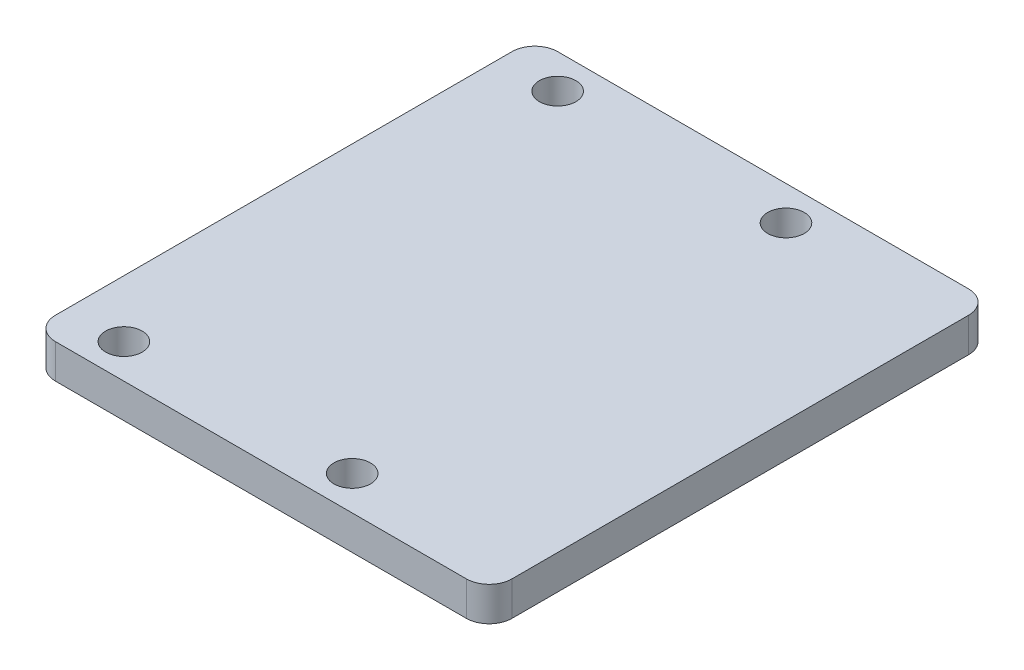
ISO-10303-21;
HEADER;
FILE_DESCRIPTION(('STEP AP214'),'2;1');
FILE_NAME('part.step','',(''),(''),'','','');
FILE_SCHEMA(('AUTOMOTIVE_DESIGN { 1 0 10303 214 1 1 1 1 }'));
ENDSEC;
DATA;
#1=APPLICATION_CONTEXT('core data for automotive mechanical design processes');
#2=APPLICATION_PROTOCOL_DEFINITION('international standard','automotive_design',2000,#1);
#3=PRODUCT_CONTEXT('',#1,'mechanical');
#4=PRODUCT('Part','Part','',(#3));
#5=PRODUCT_RELATED_PRODUCT_CATEGORY('part','',(#4));
#6=PRODUCT_DEFINITION_FORMATION('','',#4);
#7=PRODUCT_DEFINITION_CONTEXT('part definition',#1,'design');
#8=PRODUCT_DEFINITION('design','',#6,#7);
#9=PRODUCT_DEFINITION_SHAPE('','',#8);
#10=(LENGTH_UNIT() NAMED_UNIT(*) SI_UNIT(.MILLI.,.METRE.));
#11=(NAMED_UNIT(*) PLANE_ANGLE_UNIT() SI_UNIT($,.RADIAN.));
#12=(NAMED_UNIT(*) SI_UNIT($,.STERADIAN.) SOLID_ANGLE_UNIT());
#13=UNCERTAINTY_MEASURE_WITH_UNIT(LENGTH_MEASURE(1.E-05),#10,'distance_accuracy_value','');
#14=(GEOMETRIC_REPRESENTATION_CONTEXT(3) GLOBAL_UNCERTAINTY_ASSIGNED_CONTEXT((#13)) GLOBAL_UNIT_ASSIGNED_CONTEXT((#10,
#11,#12)) REPRESENTATION_CONTEXT('',''));
#15=CARTESIAN_POINT('',(0.,0.,0.));
#16=DIRECTION('',(0.,0.,1.));
#17=DIRECTION('',(1.,0.,0.));
#18=AXIS2_PLACEMENT_3D('',#15,#16,#17);
#19=CARTESIAN_POINT('',(0.,3.,0.));
#20=DIRECTION('',(0.,1.,0.));
#21=DIRECTION('',(0.,0.,1.));
#22=AXIS2_PLACEMENT_3D('',#19,#20,#21);
#23=PLANE('',#22);
#24=CARTESIAN_POINT('',(4.99999999999997,3.,-19.));
#25=DIRECTION('',(0.,1.,0.));
#26=DIRECTION('',(0.,0.,-1.));
#27=AXIS2_PLACEMENT_3D('',#24,#25,#26);
#28=CIRCLE('',#27,1.6);
#29=CARTESIAN_POINT('',(4.99999999999997,3.,-20.6));
#30=VERTEX_POINT('',#29);
#31=EDGE_CURVE('E194',#30,#30,#28,.T.);
#32=ORIENTED_EDGE('',*,*,#31,.F.);
#33=EDGE_LOOP('',(#32));
#34=FACE_BOUND('',#33,.T.);
#35=CARTESIAN_POINT('',(-15.,3.,19.));
#36=DIRECTION('',(0.,1.,0.));
#37=DIRECTION('',(0.,0.,1.));
#38=AXIS2_PLACEMENT_3D('',#35,#36,#37);
#39=CIRCLE('',#38,1.6);
#40=CARTESIAN_POINT('',(-15.,3.,20.6));
#41=VERTEX_POINT('',#40);
#42=EDGE_CURVE('E138',#41,#41,#39,.T.);
#43=ORIENTED_EDGE('',*,*,#42,.F.);
#44=EDGE_LOOP('',(#43));
#45=FACE_BOUND('',#44,.T.);
#46=DIRECTION('',(1.,0.,0.));
#47=VECTOR('',#46,1.);
#48=CARTESIAN_POINT('',(-20.,3.,22.));
#49=LINE('',#48,#47);
#50=CARTESIAN_POINT('',(-18.,3.,22.));
#51=VERTEX_POINT('',#50);
#52=CARTESIAN_POINT('',(18.,3.,22.));
#53=VERTEX_POINT('',#52);
#54=EDGE_CURVE('E144',#51,#53,#49,.T.);
#55=ORIENTED_EDGE('',*,*,#54,.T.);
#56=CARTESIAN_POINT('',(18.,3.,20.));
#57=DIRECTION('',(0.,1.,0.));
#58=DIRECTION('',(0.,0.,1.));
#59=AXIS2_PLACEMENT_3D('',#56,#57,#58);
#60=CIRCLE('',#59,2.);
#61=CARTESIAN_POINT('',(20.,3.,20.));
#62=VERTEX_POINT('',#61);
#63=EDGE_CURVE('E162',#53,#62,#60,.T.);
#64=ORIENTED_EDGE('',*,*,#63,.T.);
#65=DIRECTION('',(0.,0.,-1.));
#66=VECTOR('',#65,1.);
#67=CARTESIAN_POINT('',(20.,3.,-22.));
#68=LINE('',#67,#66);
#69=CARTESIAN_POINT('',(20.,3.,-20.));
#70=VERTEX_POINT('',#69);
#71=EDGE_CURVE('E130',#62,#70,#68,.T.);
#72=ORIENTED_EDGE('',*,*,#71,.T.);
#73=CARTESIAN_POINT('',(18.,3.,-20.));
#74=DIRECTION('',(0.,1.,0.));
#75=DIRECTION('',(0.,0.,1.));
#76=AXIS2_PLACEMENT_3D('',#73,#74,#75);
#77=CIRCLE('',#76,2.);
#78=CARTESIAN_POINT('',(18.,3.,-22.));
#79=VERTEX_POINT('',#78);
#80=EDGE_CURVE('E159',#70,#79,#77,.T.);
#81=ORIENTED_EDGE('',*,*,#80,.T.);
#82=DIRECTION('',(-1.,0.,0.));
#83=VECTOR('',#82,1.);
#84=CARTESIAN_POINT('',(-20.,3.,-22.));
#85=LINE('',#84,#83);
#86=CARTESIAN_POINT('',(-18.,3.,-22.));
#87=VERTEX_POINT('',#86);
#88=EDGE_CURVE('E174',#79,#87,#85,.T.);
#89=ORIENTED_EDGE('',*,*,#88,.T.);
#90=CARTESIAN_POINT('',(-18.,3.,-20.));
#91=DIRECTION('',(0.,1.,0.));
#92=DIRECTION('',(0.,0.,1.));
#93=AXIS2_PLACEMENT_3D('',#90,#91,#92);
#94=CIRCLE('',#93,2.);
#95=CARTESIAN_POINT('',(-20.,3.,-20.));
#96=VERTEX_POINT('',#95);
#97=EDGE_CURVE('E61',#87,#96,#94,.T.);
#98=ORIENTED_EDGE('',*,*,#97,.T.);
#99=DIRECTION('',(0.,0.,1.));
#100=VECTOR('',#99,1.);
#101=CARTESIAN_POINT('',(-20.,3.,-22.));
#102=LINE('',#101,#100);
#103=CARTESIAN_POINT('',(-20.,3.,20.));
#104=VERTEX_POINT('',#103);
#105=EDGE_CURVE('E185',#96,#104,#102,.T.);
#106=ORIENTED_EDGE('',*,*,#105,.T.);
#107=CARTESIAN_POINT('',(-18.,3.,20.));
#108=DIRECTION('',(0.,1.,0.));
#109=DIRECTION('',(0.,0.,1.));
#110=AXIS2_PLACEMENT_3D('',#107,#108,#109);
#111=CIRCLE('',#110,2.);
#112=EDGE_CURVE('E158',#104,#51,#111,.T.);
#113=ORIENTED_EDGE('',*,*,#112,.T.);
#114=EDGE_LOOP('',(#55,#64,#72,#81,#89,#98,#106,#113));
#115=FACE_BOUND('',#114,.T.);
#116=CARTESIAN_POINT('',(4.99999999999998,3.,19.));
#117=DIRECTION('',(0.,1.,0.));
#118=DIRECTION('',(0.,0.,1.));
#119=AXIS2_PLACEMENT_3D('',#116,#117,#118);
#120=CIRCLE('',#119,1.6);
#121=CARTESIAN_POINT('',(4.99999999999998,3.,20.6));
#122=VERTEX_POINT('',#121);
#123=EDGE_CURVE('E189',#122,#122,#120,.T.);
#124=ORIENTED_EDGE('',*,*,#123,.F.);
#125=EDGE_LOOP('',(#124));
#126=FACE_BOUND('',#125,.T.);
#127=CARTESIAN_POINT('',(-15.,3.,-19.));
#128=DIRECTION('',(0.,1.,0.));
#129=DIRECTION('',(0.,0.,-1.));
#130=AXIS2_PLACEMENT_3D('',#127,#128,#129);
#131=CIRCLE('',#130,1.6);
#132=CARTESIAN_POINT('',(-15.,3.,-20.6));
#133=VERTEX_POINT('',#132);
#134=EDGE_CURVE('E199',#133,#133,#131,.T.);
#135=ORIENTED_EDGE('',*,*,#134,.F.);
#136=EDGE_LOOP('',(#135));
#137=FACE_BOUND('',#136,.T.);
#138=ADVANCED_FACE('F41',(#34,#45,#115,#126,#137),#23,.T.);
#139=CARTESIAN_POINT('',(0.,0.,0.));
#140=DIRECTION('',(0.,1.,0.));
#141=DIRECTION('',(0.,0.,1.));
#142=AXIS2_PLACEMENT_3D('',#139,#140,#141);
#143=PLANE('',#142);
#144=DIRECTION('',(0.,0.,-1.));
#145=VECTOR('',#144,1.);
#146=CARTESIAN_POINT('',(20.,0.,-22.));
#147=LINE('',#146,#145);
#148=CARTESIAN_POINT('',(20.,0.,20.));
#149=VERTEX_POINT('',#148);
#150=CARTESIAN_POINT('',(20.,0.,-20.));
#151=VERTEX_POINT('',#150);
#152=EDGE_CURVE('E124',#149,#151,#147,.T.);
#153=ORIENTED_EDGE('',*,*,#152,.F.);
#154=CARTESIAN_POINT('',(18.,0.,20.));
#155=DIRECTION('',(0.,1.,0.));
#156=DIRECTION('',(0.,0.,1.));
#157=AXIS2_PLACEMENT_3D('',#154,#155,#156);
#158=CIRCLE('',#157,2.);
#159=CARTESIAN_POINT('',(18.,0.,22.));
#160=VERTEX_POINT('',#159);
#161=EDGE_CURVE('E110',#149,#160,#158,.F.);
#162=ORIENTED_EDGE('',*,*,#161,.T.);
#163=DIRECTION('',(1.,0.,0.));
#164=VECTOR('',#163,1.);
#165=CARTESIAN_POINT('',(-20.,0.,22.));
#166=LINE('',#165,#164);
#167=CARTESIAN_POINT('',(-18.,0.,22.));
#168=VERTEX_POINT('',#167);
#169=EDGE_CURVE('E149',#168,#160,#166,.T.);
#170=ORIENTED_EDGE('',*,*,#169,.F.);
#171=CARTESIAN_POINT('',(-18.,0.,20.));
#172=DIRECTION('',(0.,1.,0.));
#173=DIRECTION('',(0.,0.,1.));
#174=AXIS2_PLACEMENT_3D('',#171,#172,#173);
#175=CIRCLE('',#174,2.);
#176=CARTESIAN_POINT('',(-20.,0.,20.));
#177=VERTEX_POINT('',#176);
#178=EDGE_CURVE('E126',#168,#177,#175,.F.);
#179=ORIENTED_EDGE('',*,*,#178,.T.);
#180=DIRECTION('',(0.,0.,1.));
#181=VECTOR('',#180,1.);
#182=CARTESIAN_POINT('',(-20.,0.,-22.));
#183=LINE('',#182,#181);
#184=CARTESIAN_POINT('',(-20.,0.,-20.));
#185=VERTEX_POINT('',#184);
#186=EDGE_CURVE('E139',#185,#177,#183,.T.);
#187=ORIENTED_EDGE('',*,*,#186,.F.);
#188=CARTESIAN_POINT('',(-18.,0.,-20.));
#189=DIRECTION('',(0.,1.,0.));
#190=DIRECTION('',(0.,0.,1.));
#191=AXIS2_PLACEMENT_3D('',#188,#189,#190);
#192=CIRCLE('',#191,2.);
#193=CARTESIAN_POINT('',(-18.,0.,-22.));
#194=VERTEX_POINT('',#193);
#195=EDGE_CURVE('E116',#185,#194,#192,.F.);
#196=ORIENTED_EDGE('',*,*,#195,.T.);
#197=DIRECTION('',(-1.,0.,0.));
#198=VECTOR('',#197,1.);
#199=CARTESIAN_POINT('',(-20.,0.,-22.));
#200=LINE('',#199,#198);
#201=CARTESIAN_POINT('',(18.,0.,-22.));
#202=VERTEX_POINT('',#201);
#203=EDGE_CURVE('E132',#202,#194,#200,.T.);
#204=ORIENTED_EDGE('',*,*,#203,.F.);
#205=CARTESIAN_POINT('',(18.,0.,-20.));
#206=DIRECTION('',(0.,1.,0.));
#207=DIRECTION('',(0.,0.,1.));
#208=AXIS2_PLACEMENT_3D('',#205,#206,#207);
#209=CIRCLE('',#208,2.);
#210=EDGE_CURVE('E134',#202,#151,#209,.F.);
#211=ORIENTED_EDGE('',*,*,#210,.T.);
#212=EDGE_LOOP('',(#153,#162,#170,#179,#187,#196,#204,#211));
#213=FACE_BOUND('',#212,.T.);
#214=CARTESIAN_POINT('',(-15.,0.,19.));
#215=DIRECTION('',(0.,1.,0.));
#216=DIRECTION('',(0.,0.,1.));
#217=AXIS2_PLACEMENT_3D('',#214,#215,#216);
#218=CIRCLE('',#217,1.6);
#219=CARTESIAN_POINT('',(-15.,0.,20.6));
#220=VERTEX_POINT('',#219);
#221=EDGE_CURVE('E142',#220,#220,#218,.T.);
#222=ORIENTED_EDGE('',*,*,#221,.T.);
#223=EDGE_LOOP('',(#222));
#224=FACE_BOUND('',#223,.T.);
#225=CARTESIAN_POINT('',(4.99999999999998,0.,19.));
#226=DIRECTION('',(0.,1.,0.));
#227=DIRECTION('',(0.,0.,1.));
#228=AXIS2_PLACEMENT_3D('',#225,#226,#227);
#229=CIRCLE('',#228,1.6);
#230=CARTESIAN_POINT('',(4.99999999999998,0.,20.6));
#231=VERTEX_POINT('',#230);
#232=EDGE_CURVE('E193',#231,#231,#229,.T.);
#233=ORIENTED_EDGE('',*,*,#232,.T.);
#234=EDGE_LOOP('',(#233));
#235=FACE_BOUND('',#234,.T.);
#236=CARTESIAN_POINT('',(4.99999999999997,0.,-19.));
#237=DIRECTION('',(0.,1.,0.));
#238=DIRECTION('',(0.,0.,-1.));
#239=AXIS2_PLACEMENT_3D('',#236,#237,#238);
#240=CIRCLE('',#239,1.6);
#241=CARTESIAN_POINT('',(4.99999999999997,0.,-20.6));
#242=VERTEX_POINT('',#241);
#243=EDGE_CURVE('E197',#242,#242,#240,.T.);
#244=ORIENTED_EDGE('',*,*,#243,.T.);
#245=EDGE_LOOP('',(#244));
#246=FACE_BOUND('',#245,.T.);
#247=CARTESIAN_POINT('',(-15.,0.,-19.));
#248=DIRECTION('',(0.,1.,0.));
#249=DIRECTION('',(0.,0.,-1.));
#250=AXIS2_PLACEMENT_3D('',#247,#248,#249);
#251=CIRCLE('',#250,1.6);
#252=CARTESIAN_POINT('',(-15.,0.,-20.6));
#253=VERTEX_POINT('',#252);
#254=EDGE_CURVE('E201',#253,#253,#251,.T.);
#255=ORIENTED_EDGE('',*,*,#254,.T.);
#256=EDGE_LOOP('',(#255));
#257=FACE_BOUND('',#256,.T.);
#258=ADVANCED_FACE('F133',(#213,#224,#235,#246,#257),#143,.F.);
#259=CARTESIAN_POINT('',(20.,3.,-22.));
#260=DIRECTION('',(-1.,0.,0.));
#261=DIRECTION('',(0.,0.,1.));
#262=AXIS2_PLACEMENT_3D('',#259,#260,#261);
#263=PLANE('',#262);
#264=ORIENTED_EDGE('',*,*,#71,.F.);
#265=DIRECTION('',(0.,-1.,0.));
#266=VECTOR('',#265,1.);
#267=CARTESIAN_POINT('',(20.,3.,20.));
#268=LINE('',#267,#266);
#269=EDGE_CURVE('E112',#62,#149,#268,.T.);
#270=ORIENTED_EDGE('',*,*,#269,.T.);
#271=ORIENTED_EDGE('',*,*,#152,.T.);
#272=DIRECTION('',(0.,-1.,0.));
#273=VECTOR('',#272,1.);
#274=CARTESIAN_POINT('',(20.,3.,-20.));
#275=LINE('',#274,#273);
#276=EDGE_CURVE('E129',#151,#70,#275,.F.);
#277=ORIENTED_EDGE('',*,*,#276,.T.);
#278=EDGE_LOOP('',(#264,#270,#271,#277));
#279=FACE_BOUND('',#278,.T.);
#280=ADVANCED_FACE('F121',(#279),#263,.F.);
#281=CARTESIAN_POINT('',(-20.,3.,-22.));
#282=DIRECTION('',(0.,0.,1.));
#283=DIRECTION('',(1.,0.,0.));
#284=AXIS2_PLACEMENT_3D('',#281,#282,#283);
#285=PLANE('',#284);
#286=ORIENTED_EDGE('',*,*,#203,.T.);
#287=DIRECTION('',(0.,-1.,0.));
#288=VECTOR('',#287,1.);
#289=CARTESIAN_POINT('',(-18.,3.,-22.));
#290=LINE('',#289,#288);
#291=EDGE_CURVE('E11',#194,#87,#290,.F.);
#292=ORIENTED_EDGE('',*,*,#291,.T.);
#293=ORIENTED_EDGE('',*,*,#88,.F.);
#294=DIRECTION('',(0.,-1.,0.));
#295=VECTOR('',#294,1.);
#296=CARTESIAN_POINT('',(18.,3.,-22.));
#297=LINE('',#296,#295);
#298=EDGE_CURVE('E47',#79,#202,#297,.T.);
#299=ORIENTED_EDGE('',*,*,#298,.T.);
#300=EDGE_LOOP('',(#286,#292,#293,#299));
#301=FACE_BOUND('',#300,.T.);
#302=ADVANCED_FACE('F175',(#301),#285,.F.);
#303=CARTESIAN_POINT('',(-20.,3.,-22.));
#304=DIRECTION('',(1.,0.,0.));
#305=DIRECTION('',(0.,0.,-1.));
#306=AXIS2_PLACEMENT_3D('',#303,#304,#305);
#307=PLANE('',#306);
#308=ORIENTED_EDGE('',*,*,#105,.F.);
#309=DIRECTION('',(0.,-1.,0.));
#310=VECTOR('',#309,1.);
#311=CARTESIAN_POINT('',(-20.,3.,-20.));
#312=LINE('',#311,#310);
#313=EDGE_CURVE('E167',#96,#185,#312,.T.);
#314=ORIENTED_EDGE('',*,*,#313,.T.);
#315=ORIENTED_EDGE('',*,*,#186,.T.);
#316=DIRECTION('',(0.,-1.,0.));
#317=VECTOR('',#316,1.);
#318=CARTESIAN_POINT('',(-20.,3.,20.));
#319=LINE('',#318,#317);
#320=EDGE_CURVE('E57',#177,#104,#319,.F.);
#321=ORIENTED_EDGE('',*,*,#320,.T.);
#322=EDGE_LOOP('',(#308,#314,#315,#321));
#323=FACE_BOUND('',#322,.T.);
#324=ADVANCED_FACE('F182',(#323),#307,.F.);
#325=CARTESIAN_POINT('',(-20.,3.,22.));
#326=DIRECTION('',(0.,0.,-1.));
#327=DIRECTION('',(-1.,0.,0.));
#328=AXIS2_PLACEMENT_3D('',#325,#326,#327);
#329=PLANE('',#328);
#330=ORIENTED_EDGE('',*,*,#169,.T.);
#331=DIRECTION('',(0.,-1.,0.));
#332=VECTOR('',#331,1.);
#333=CARTESIAN_POINT('',(18.,3.,22.));
#334=LINE('',#333,#332);
#335=EDGE_CURVE('E115',#160,#53,#334,.F.);
#336=ORIENTED_EDGE('',*,*,#335,.T.);
#337=ORIENTED_EDGE('',*,*,#54,.F.);
#338=DIRECTION('',(0.,-1.,0.));
#339=VECTOR('',#338,1.);
#340=CARTESIAN_POINT('',(-18.,3.,22.));
#341=LINE('',#340,#339);
#342=EDGE_CURVE('E120',#51,#168,#341,.T.);
#343=ORIENTED_EDGE('',*,*,#342,.T.);
#344=EDGE_LOOP('',(#330,#336,#337,#343));
#345=FACE_BOUND('',#344,.T.);
#346=ADVANCED_FACE('F228',(#345),#329,.F.);
#347=CARTESIAN_POINT('',(-15.,3.,19.));
#348=DIRECTION('',(0.,-1.,0.));
#349=DIRECTION('',(0.,0.,-1.));
#350=AXIS2_PLACEMENT_3D('',#347,#348,#349);
#351=CYLINDRICAL_SURFACE('',#350,1.6);
#352=ORIENTED_EDGE('',*,*,#42,.T.);
#353=EDGE_LOOP('',(#352));
#354=FACE_BOUND('',#353,.T.);
#355=ORIENTED_EDGE('',*,*,#221,.F.);
#356=EDGE_LOOP('',(#355));
#357=FACE_BOUND('',#356,.T.);
#358=ADVANCED_FACE('F224',(#354,#357),#351,.F.);
#359=CARTESIAN_POINT('',(4.99999999999998,3.,19.));
#360=DIRECTION('',(0.,-1.,0.));
#361=DIRECTION('',(0.,0.,-1.));
#362=AXIS2_PLACEMENT_3D('',#359,#360,#361);
#363=CYLINDRICAL_SURFACE('',#362,1.6);
#364=ORIENTED_EDGE('',*,*,#123,.T.);
#365=EDGE_LOOP('',(#364));
#366=FACE_BOUND('',#365,.T.);
#367=ORIENTED_EDGE('',*,*,#232,.F.);
#368=EDGE_LOOP('',(#367));
#369=FACE_BOUND('',#368,.T.);
#370=ADVANCED_FACE('F247',(#366,#369),#363,.F.);
#371=CARTESIAN_POINT('',(4.99999999999997,3.,-19.));
#372=DIRECTION('',(0.,-1.,0.));
#373=DIRECTION('',(0.,0.,-1.));
#374=AXIS2_PLACEMENT_3D('',#371,#372,#373);
#375=CYLINDRICAL_SURFACE('',#374,1.6);
#376=ORIENTED_EDGE('',*,*,#31,.T.);
#377=EDGE_LOOP('',(#376));
#378=FACE_BOUND('',#377,.T.);
#379=ORIENTED_EDGE('',*,*,#243,.F.);
#380=EDGE_LOOP('',(#379));
#381=FACE_BOUND('',#380,.T.);
#382=ADVANCED_FACE('F251',(#378,#381),#375,.F.);
#383=CARTESIAN_POINT('',(-15.,3.,-19.));
#384=DIRECTION('',(0.,-1.,0.));
#385=DIRECTION('',(0.,0.,-1.));
#386=AXIS2_PLACEMENT_3D('',#383,#384,#385);
#387=CYLINDRICAL_SURFACE('',#386,1.6);
#388=ORIENTED_EDGE('',*,*,#134,.T.);
#389=EDGE_LOOP('',(#388));
#390=FACE_BOUND('',#389,.T.);
#391=ORIENTED_EDGE('',*,*,#254,.F.);
#392=EDGE_LOOP('',(#391));
#393=FACE_BOUND('',#392,.T.);
#394=ADVANCED_FACE('F207',(#390,#393),#387,.F.);
#395=CARTESIAN_POINT('',(18.,3.,20.));
#396=DIRECTION('',(0.,-1.,0.));
#397=DIRECTION('',(0.,0.,-1.));
#398=AXIS2_PLACEMENT_3D('',#395,#396,#397);
#399=CYLINDRICAL_SURFACE('',#398,2.);
#400=ORIENTED_EDGE('',*,*,#63,.F.);
#401=ORIENTED_EDGE('',*,*,#335,.F.);
#402=ORIENTED_EDGE('',*,*,#161,.F.);
#403=ORIENTED_EDGE('',*,*,#269,.F.);
#404=EDGE_LOOP('',(#400,#401,#402,#403));
#405=FACE_BOUND('',#404,.T.);
#406=ADVANCED_FACE('F109',(#405),#399,.T.);
#407=CARTESIAN_POINT('',(-18.,3.,-20.));
#408=DIRECTION('',(0.,-1.,0.));
#409=DIRECTION('',(0.,0.,-1.));
#410=AXIS2_PLACEMENT_3D('',#407,#408,#409);
#411=CYLINDRICAL_SURFACE('',#410,2.);
#412=ORIENTED_EDGE('',*,*,#97,.F.);
#413=ORIENTED_EDGE('',*,*,#291,.F.);
#414=ORIENTED_EDGE('',*,*,#195,.F.);
#415=ORIENTED_EDGE('',*,*,#313,.F.);
#416=EDGE_LOOP('',(#412,#413,#414,#415));
#417=FACE_BOUND('',#416,.T.);
#418=ADVANCED_FACE('F177',(#417),#411,.T.);
#419=CARTESIAN_POINT('',(18.,3.,-20.));
#420=DIRECTION('',(0.,-1.,0.));
#421=DIRECTION('',(0.,0.,-1.));
#422=AXIS2_PLACEMENT_3D('',#419,#420,#421);
#423=CYLINDRICAL_SURFACE('',#422,2.);
#424=ORIENTED_EDGE('',*,*,#80,.F.);
#425=ORIENTED_EDGE('',*,*,#276,.F.);
#426=ORIENTED_EDGE('',*,*,#210,.F.);
#427=ORIENTED_EDGE('',*,*,#298,.F.);
#428=EDGE_LOOP('',(#424,#425,#426,#427));
#429=FACE_BOUND('',#428,.T.);
#430=ADVANCED_FACE('F239',(#429),#423,.T.);
#431=CARTESIAN_POINT('',(-18.,3.,20.));
#432=DIRECTION('',(0.,-1.,0.));
#433=DIRECTION('',(0.,0.,-1.));
#434=AXIS2_PLACEMENT_3D('',#431,#432,#433);
#435=CYLINDRICAL_SURFACE('',#434,2.);
#436=ORIENTED_EDGE('',*,*,#112,.F.);
#437=ORIENTED_EDGE('',*,*,#320,.F.);
#438=ORIENTED_EDGE('',*,*,#178,.F.);
#439=ORIENTED_EDGE('',*,*,#342,.F.);
#440=EDGE_LOOP('',(#436,#437,#438,#439));
#441=FACE_BOUND('',#440,.T.);
#442=ADVANCED_FACE('F43',(#441),#435,.T.);
#443=CLOSED_SHELL('',(#138,#258,#280,#302,#324,#346,#358,#370,#382,#394,#406,#418,#430,#442));
#444=MANIFOLD_SOLID_BREP('B2',#443);
#445=ADVANCED_BREP_SHAPE_REPRESENTATION('',(#18,#444),#14);
#446=SHAPE_DEFINITION_REPRESENTATION(#9,#445);
ENDSEC;
END-ISO-10303-21;
